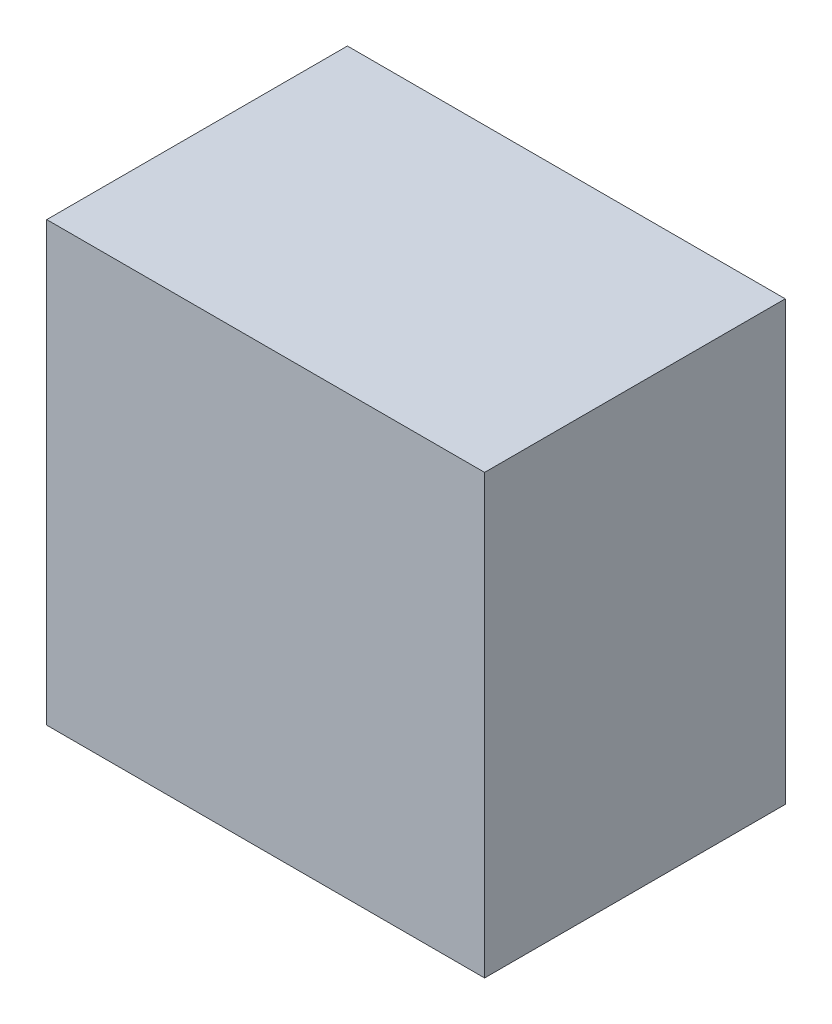
ISO-10303-21;
HEADER;
FILE_DESCRIPTION(('STEP AP214'),'2;1');
FILE_NAME('part.step','',(''),(''),'','','');
FILE_SCHEMA(('AUTOMOTIVE_DESIGN { 1 0 10303 214 1 1 1 1 }'));
ENDSEC;
DATA;
#1=APPLICATION_CONTEXT('core data for automotive mechanical design processes');
#2=APPLICATION_PROTOCOL_DEFINITION('international standard','automotive_design',2000,#1);
#3=PRODUCT_CONTEXT('',#1,'mechanical');
#4=PRODUCT('Part','Part','',(#3));
#5=PRODUCT_RELATED_PRODUCT_CATEGORY('part','',(#4));
#6=PRODUCT_DEFINITION_FORMATION('','',#4);
#7=PRODUCT_DEFINITION_CONTEXT('part definition',#1,'design');
#8=PRODUCT_DEFINITION('design','',#6,#7);
#9=PRODUCT_DEFINITION_SHAPE('','',#8);
#10=(LENGTH_UNIT() NAMED_UNIT(*) SI_UNIT(.MILLI.,.METRE.));
#11=(NAMED_UNIT(*) PLANE_ANGLE_UNIT() SI_UNIT($,.RADIAN.));
#12=(NAMED_UNIT(*) SI_UNIT($,.STERADIAN.) SOLID_ANGLE_UNIT());
#13=UNCERTAINTY_MEASURE_WITH_UNIT(LENGTH_MEASURE(1.E-05),#10,'distance_accuracy_value','');
#14=(GEOMETRIC_REPRESENTATION_CONTEXT(3) GLOBAL_UNCERTAINTY_ASSIGNED_CONTEXT((#13)) GLOBAL_UNIT_ASSIGNED_CONTEXT((#10,
#11,#12)) REPRESENTATION_CONTEXT('',''));
#15=CARTESIAN_POINT('',(0.,0.,0.));
#16=DIRECTION('',(0.,0.,1.));
#17=DIRECTION('',(1.,0.,0.));
#18=AXIS2_PLACEMENT_3D('',#15,#16,#17);
#19=CARTESIAN_POINT('',(7.5,-7.5,10.3));
#20=DIRECTION('',(-1.,0.,0.));
#21=DIRECTION('',(0.,0.,1.));
#22=AXIS2_PLACEMENT_3D('',#19,#20,#21);
#23=PLANE('',#22);
#24=DIRECTION('',(0.,1.,0.));
#25=VECTOR('',#24,1.);
#26=CARTESIAN_POINT('',(7.5,-7.5,0.));
#27=LINE('',#26,#25);
#28=CARTESIAN_POINT('',(7.5,-7.5,0.));
#29=VERTEX_POINT('',#28);
#30=CARTESIAN_POINT('',(7.5,7.5,0.));
#31=VERTEX_POINT('',#30);
#32=EDGE_CURVE('E113',#29,#31,#27,.T.);
#33=ORIENTED_EDGE('',*,*,#32,.T.);
#34=DIRECTION('',(0.,0.,-1.));
#35=VECTOR('',#34,1.);
#36=CARTESIAN_POINT('',(7.5,7.5,10.3));
#37=LINE('',#36,#35);
#38=CARTESIAN_POINT('',(7.5,7.5,10.3));
#39=VERTEX_POINT('',#38);
#40=EDGE_CURVE('E11',#39,#31,#37,.T.);
#41=ORIENTED_EDGE('',*,*,#40,.F.);
#42=DIRECTION('',(0.,1.,0.));
#43=VECTOR('',#42,1.);
#44=CARTESIAN_POINT('',(7.5,-7.5,10.3));
#45=LINE('',#44,#43);
#46=CARTESIAN_POINT('',(7.5,-7.5,10.3));
#47=VERTEX_POINT('',#46);
#48=EDGE_CURVE('E97',#47,#39,#45,.T.);
#49=ORIENTED_EDGE('',*,*,#48,.F.);
#50=DIRECTION('',(0.,0.,-1.));
#51=VECTOR('',#50,1.);
#52=CARTESIAN_POINT('',(7.5,-7.5,10.3));
#53=LINE('',#52,#51);
#54=EDGE_CURVE('E109',#47,#29,#53,.T.);
#55=ORIENTED_EDGE('',*,*,#54,.T.);
#56=EDGE_LOOP('',(#33,#41,#49,#55));
#57=FACE_BOUND('',#56,.T.);
#58=ADVANCED_FACE('F45',(#57),#23,.F.);
#59=CARTESIAN_POINT('',(-7.5,7.5,10.3));
#60=DIRECTION('',(0.,-1.,0.));
#61=DIRECTION('',(0.,0.,-1.));
#62=AXIS2_PLACEMENT_3D('',#59,#60,#61);
#63=PLANE('',#62);
#64=DIRECTION('',(-1.,0.,0.));
#65=VECTOR('',#64,1.);
#66=CARTESIAN_POINT('',(-7.5,7.5,0.));
#67=LINE('',#66,#65);
#68=CARTESIAN_POINT('',(-7.5,7.5,0.));
#69=VERTEX_POINT('',#68);
#70=EDGE_CURVE('E102',#31,#69,#67,.T.);
#71=ORIENTED_EDGE('',*,*,#70,.T.);
#72=DIRECTION('',(0.,0.,-1.));
#73=VECTOR('',#72,1.);
#74=CARTESIAN_POINT('',(-7.5,7.5,10.3));
#75=LINE('',#74,#73);
#76=CARTESIAN_POINT('',(-7.5,7.5,10.3));
#77=VERTEX_POINT('',#76);
#78=EDGE_CURVE('E54',#77,#69,#75,.T.);
#79=ORIENTED_EDGE('',*,*,#78,.F.);
#80=DIRECTION('',(-1.,0.,0.));
#81=VECTOR('',#80,1.);
#82=CARTESIAN_POINT('',(-7.5,7.5,10.3));
#83=LINE('',#82,#81);
#84=EDGE_CURVE('E92',#39,#77,#83,.T.);
#85=ORIENTED_EDGE('',*,*,#84,.F.);
#86=ORIENTED_EDGE('',*,*,#40,.T.);
#87=EDGE_LOOP('',(#71,#79,#85,#86));
#88=FACE_BOUND('',#87,.T.);
#89=ADVANCED_FACE('F101',(#88),#63,.F.);
#90=CARTESIAN_POINT('',(-7.5,-7.5,10.3));
#91=DIRECTION('',(1.,0.,0.));
#92=DIRECTION('',(0.,0.,-1.));
#93=AXIS2_PLACEMENT_3D('',#90,#91,#92);
#94=PLANE('',#93);
#95=DIRECTION('',(0.,-1.,0.));
#96=VECTOR('',#95,1.);
#97=CARTESIAN_POINT('',(-7.5,-7.5,0.));
#98=LINE('',#97,#96);
#99=CARTESIAN_POINT('',(-7.5,-7.5,0.));
#100=VERTEX_POINT('',#99);
#101=EDGE_CURVE('E79',#69,#100,#98,.T.);
#102=ORIENTED_EDGE('',*,*,#101,.T.);
#103=DIRECTION('',(0.,0.,-1.));
#104=VECTOR('',#103,1.);
#105=CARTESIAN_POINT('',(-7.5,-7.5,10.3));
#106=LINE('',#105,#104);
#107=CARTESIAN_POINT('',(-7.5,-7.5,10.3));
#108=VERTEX_POINT('',#107);
#109=EDGE_CURVE('E104',#108,#100,#106,.T.);
#110=ORIENTED_EDGE('',*,*,#109,.F.);
#111=DIRECTION('',(0.,-1.,0.));
#112=VECTOR('',#111,1.);
#113=CARTESIAN_POINT('',(-7.5,-7.5,10.3));
#114=LINE('',#113,#112);
#115=EDGE_CURVE('E95',#77,#108,#114,.T.);
#116=ORIENTED_EDGE('',*,*,#115,.F.);
#117=ORIENTED_EDGE('',*,*,#78,.T.);
#118=EDGE_LOOP('',(#102,#110,#116,#117));
#119=FACE_BOUND('',#118,.T.);
#120=ADVANCED_FACE('F105',(#119),#94,.F.);
#121=CARTESIAN_POINT('',(-7.5,-7.5,10.3));
#122=DIRECTION('',(0.,1.,0.));
#123=DIRECTION('',(0.,0.,1.));
#124=AXIS2_PLACEMENT_3D('',#121,#122,#123);
#125=PLANE('',#124);
#126=DIRECTION('',(1.,0.,0.));
#127=VECTOR('',#126,1.);
#128=CARTESIAN_POINT('',(-7.5,-7.5,0.));
#129=LINE('',#128,#127);
#130=EDGE_CURVE('E85',#100,#29,#129,.T.);
#131=ORIENTED_EDGE('',*,*,#130,.T.);
#132=ORIENTED_EDGE('',*,*,#54,.F.);
#133=DIRECTION('',(1.,0.,0.));
#134=VECTOR('',#133,1.);
#135=CARTESIAN_POINT('',(-7.5,-7.5,10.3));
#136=LINE('',#135,#134);
#137=EDGE_CURVE('E62',#108,#47,#136,.T.);
#138=ORIENTED_EDGE('',*,*,#137,.F.);
#139=ORIENTED_EDGE('',*,*,#109,.T.);
#140=EDGE_LOOP('',(#131,#132,#138,#139));
#141=FACE_BOUND('',#140,.T.);
#142=ADVANCED_FACE('F126',(#141),#125,.F.);
#143=CARTESIAN_POINT('',(0.,0.,10.3));
#144=DIRECTION('',(0.,0.,-1.));
#145=DIRECTION('',(-1.,0.,0.));
#146=AXIS2_PLACEMENT_3D('',#143,#144,#145);
#147=PLANE('',#146);
#148=ORIENTED_EDGE('',*,*,#48,.T.);
#149=ORIENTED_EDGE('',*,*,#84,.T.);
#150=ORIENTED_EDGE('',*,*,#115,.T.);
#151=ORIENTED_EDGE('',*,*,#137,.T.);
#152=EDGE_LOOP('',(#148,#149,#150,#151));
#153=FACE_BOUND('',#152,.T.);
#154=ADVANCED_FACE('F93',(#153),#147,.F.);
#155=CARTESIAN_POINT('',(0.,0.,0.));
#156=DIRECTION('',(0.,0.,-1.));
#157=DIRECTION('',(-1.,0.,0.));
#158=AXIS2_PLACEMENT_3D('',#155,#156,#157);
#159=PLANE('',#158);
#160=ORIENTED_EDGE('',*,*,#32,.F.);
#161=ORIENTED_EDGE('',*,*,#130,.F.);
#162=ORIENTED_EDGE('',*,*,#101,.F.);
#163=ORIENTED_EDGE('',*,*,#70,.F.);
#164=EDGE_LOOP('',(#160,#161,#162,#163));
#165=FACE_BOUND('',#164,.T.);
#166=ADVANCED_FACE('F129',(#165),#159,.T.);
#167=CLOSED_SHELL('',(#58,#89,#120,#142,#154,#166));
#168=MANIFOLD_SOLID_BREP('B2',#167);
#169=ADVANCED_BREP_SHAPE_REPRESENTATION('',(#18,#168),#14);
#170=SHAPE_DEFINITION_REPRESENTATION(#9,#169);
ENDSEC;
END-ISO-10303-21;
